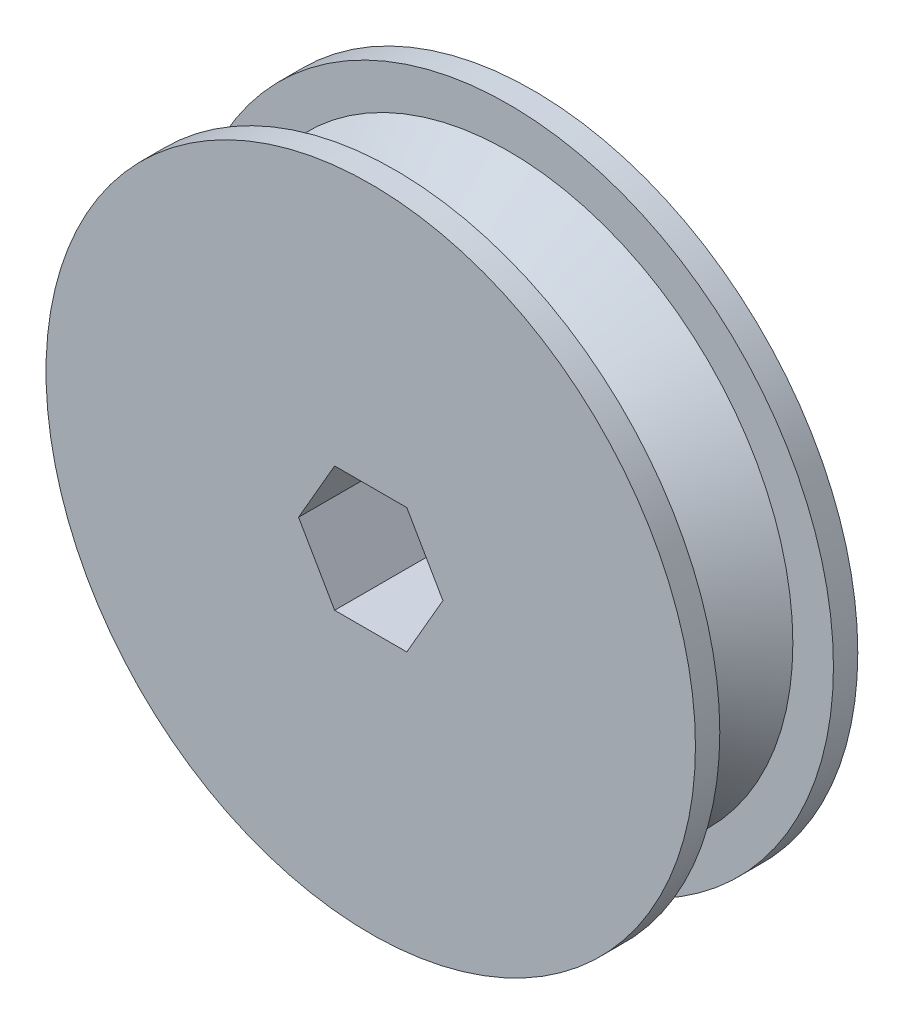
ISO-10303-21;
HEADER;
FILE_DESCRIPTION(('STEP AP214'),'2;1');
FILE_NAME('part.step','',(''),(''),'','','');
FILE_SCHEMA(('AUTOMOTIVE_DESIGN { 1 0 10303 214 1 1 1 1 }'));
ENDSEC;
DATA;
#1=APPLICATION_CONTEXT('core data for automotive mechanical design processes');
#2=APPLICATION_PROTOCOL_DEFINITION('international standard','automotive_design',2000,#1);
#3=PRODUCT_CONTEXT('',#1,'mechanical');
#4=PRODUCT('Part','Part','',(#3));
#5=PRODUCT_RELATED_PRODUCT_CATEGORY('part','',(#4));
#6=PRODUCT_DEFINITION_FORMATION('','',#4);
#7=PRODUCT_DEFINITION_CONTEXT('part definition',#1,'design');
#8=PRODUCT_DEFINITION('design','',#6,#7);
#9=PRODUCT_DEFINITION_SHAPE('','',#8);
#10=(LENGTH_UNIT() NAMED_UNIT(*) SI_UNIT(.MILLI.,.METRE.));
#11=(NAMED_UNIT(*) PLANE_ANGLE_UNIT() SI_UNIT($,.RADIAN.));
#12=(NAMED_UNIT(*) SI_UNIT($,.STERADIAN.) SOLID_ANGLE_UNIT());
#13=UNCERTAINTY_MEASURE_WITH_UNIT(LENGTH_MEASURE(1.E-05),#10,'distance_accuracy_value','');
#14=(GEOMETRIC_REPRESENTATION_CONTEXT(3) GLOBAL_UNCERTAINTY_ASSIGNED_CONTEXT((#13)) GLOBAL_UNIT_ASSIGNED_CONTEXT((#10,
#11,#12)) REPRESENTATION_CONTEXT('',''));
#15=CARTESIAN_POINT('',(0.,0.,0.));
#16=DIRECTION('',(0.,0.,1.));
#17=DIRECTION('',(1.,0.,0.));
#18=AXIS2_PLACEMENT_3D('',#15,#16,#17);
#19=CARTESIAN_POINT('',(0.,0.,6.35));
#20=DIRECTION('',(0.,0.,-1.));
#21=DIRECTION('',(-1.,0.,0.));
#22=AXIS2_PLACEMENT_3D('',#19,#20,#21);
#23=CYLINDRICAL_SURFACE('',#22,25.4);
#24=CARTESIAN_POINT('',(0.,0.,6.35));
#25=DIRECTION('',(0.,0.,1.));
#26=DIRECTION('',(1.,0.,0.));
#27=AXIS2_PLACEMENT_3D('',#24,#25,#26);
#28=CIRCLE('',#27,25.4);
#29=CARTESIAN_POINT('',(25.4,0.,6.35));
#30=VERTEX_POINT('',#29);
#31=EDGE_CURVE('E11',#30,#30,#28,.T.);
#32=ORIENTED_EDGE('',*,*,#31,.F.);
#33=EDGE_LOOP('',(#32));
#34=FACE_BOUND('',#33,.T.);
#35=CARTESIAN_POINT('',(0.,0.,4.445));
#36=DIRECTION('',(0.,0.,1.));
#37=DIRECTION('',(1.,0.,0.));
#38=AXIS2_PLACEMENT_3D('',#35,#36,#37);
#39=CIRCLE('',#38,25.4);
#40=CARTESIAN_POINT('',(25.4,0.,4.445));
#41=VERTEX_POINT('',#40);
#42=EDGE_CURVE('E143',#41,#41,#39,.T.);
#43=ORIENTED_EDGE('',*,*,#42,.T.);
#44=EDGE_LOOP('',(#43));
#45=FACE_BOUND('',#44,.T.);
#46=ADVANCED_FACE('F33',(#34,#45),#23,.T.);
#47=CARTESIAN_POINT('',(0.,0.,6.35));
#48=DIRECTION('',(0.,0.,1.));
#49=DIRECTION('',(1.,0.,0.));
#50=AXIS2_PLACEMENT_3D('',#47,#48,#49);
#51=PLANE('',#50);
#52=DIRECTION('',(-0.499999999999999,0.86602540378444,0.));
#53=VECTOR('',#52,1.);
#54=CARTESIAN_POINT('',(-2.82295414120268,-4.8895,6.35));
#55=LINE('',#54,#53);
#56=CARTESIAN_POINT('',(-2.82295414120268,-4.8895,6.35));
#57=VERTEX_POINT('',#56);
#58=CARTESIAN_POINT('',(-5.64590828240534,0.,6.35));
#59=VERTEX_POINT('',#58);
#60=EDGE_CURVE('E87',#57,#59,#55,.T.);
#61=ORIENTED_EDGE('',*,*,#60,.T.);
#62=DIRECTION('',(0.499999999999998,0.86602540378444,0.));
#63=VECTOR('',#62,1.);
#64=CARTESIAN_POINT('',(-5.64590828240534,0.,6.35));
#65=LINE('',#64,#63);
#66=CARTESIAN_POINT('',(-2.82295414120268,4.8895,6.35));
#67=VERTEX_POINT('',#66);
#68=EDGE_CURVE('E96',#59,#67,#65,.T.);
#69=ORIENTED_EDGE('',*,*,#68,.T.);
#70=DIRECTION('',(1.,0.,0.));
#71=VECTOR('',#70,1.);
#72=CARTESIAN_POINT('',(-2.82295414120268,4.8895,6.35));
#73=LINE('',#72,#71);
#74=CARTESIAN_POINT('',(2.82295414120268,4.8895,6.35));
#75=VERTEX_POINT('',#74);
#76=EDGE_CURVE('E47',#67,#75,#73,.T.);
#77=ORIENTED_EDGE('',*,*,#76,.T.);
#78=DIRECTION('',(0.499999999999999,-0.86602540378444,0.));
#79=VECTOR('',#78,1.);
#80=CARTESIAN_POINT('',(2.82295414120268,4.8895,6.35));
#81=LINE('',#80,#79);
#82=CARTESIAN_POINT('',(5.64590828240535,0.,6.35));
#83=VERTEX_POINT('',#82);
#84=EDGE_CURVE('E111',#75,#83,#81,.T.);
#85=ORIENTED_EDGE('',*,*,#84,.T.);
#86=DIRECTION('',(-0.499999999999998,-0.86602540378444,0.));
#87=VECTOR('',#86,1.);
#88=CARTESIAN_POINT('',(5.64590828240535,0.,6.35));
#89=LINE('',#88,#87);
#90=CARTESIAN_POINT('',(2.82295414120269,-4.8895,6.35));
#91=VERTEX_POINT('',#90);
#92=EDGE_CURVE('E114',#83,#91,#89,.T.);
#93=ORIENTED_EDGE('',*,*,#92,.T.);
#94=DIRECTION('',(-1.,0.,0.));
#95=VECTOR('',#94,1.);
#96=CARTESIAN_POINT('',(2.82295414120269,-4.8895,6.35));
#97=LINE('',#96,#95);
#98=EDGE_CURVE('E93',#91,#57,#97,.T.);
#99=ORIENTED_EDGE('',*,*,#98,.T.);
#100=EDGE_LOOP('',(#61,#69,#77,#85,#93,#99));
#101=FACE_BOUND('',#100,.T.);
#102=ORIENTED_EDGE('',*,*,#31,.T.);
#103=EDGE_LOOP('',(#102));
#104=FACE_BOUND('',#103,.T.);
#105=ADVANCED_FACE('F100',(#101,#104),#51,.T.);
#106=CARTESIAN_POINT('',(0.,0.,0.));
#107=DIRECTION('',(0.,0.,-1.));
#108=DIRECTION('',(-1.,0.,0.));
#109=AXIS2_PLACEMENT_3D('',#106,#107,#108);
#110=CONICAL_SURFACE('',#109,17.78,0.785398163397449);
#111=CARTESIAN_POINT('',(0.,0.,-4.445));
#112=DIRECTION('',(0.,0.,1.));
#113=DIRECTION('',(1.,0.,0.));
#114=AXIS2_PLACEMENT_3D('',#111,#112,#113);
#115=CIRCLE('',#114,22.225);
#116=CARTESIAN_POINT('',(22.225,0.,-4.445));
#117=VERTEX_POINT('',#116);
#118=EDGE_CURVE('E130',#117,#117,#115,.T.);
#119=ORIENTED_EDGE('',*,*,#118,.T.);
#120=EDGE_LOOP('',(#119));
#121=FACE_BOUND('',#120,.T.);
#122=CARTESIAN_POINT('',(0.,0.,0.));
#123=DIRECTION('',(0.,0.,1.));
#124=DIRECTION('',(1.,0.,0.));
#125=AXIS2_PLACEMENT_3D('',#122,#123,#124);
#126=CIRCLE('',#125,17.78);
#127=CARTESIAN_POINT('',(17.78,0.,0.));
#128=VERTEX_POINT('',#127);
#129=EDGE_CURVE('E149',#128,#128,#126,.T.);
#130=ORIENTED_EDGE('',*,*,#129,.F.);
#131=EDGE_LOOP('',(#130));
#132=FACE_BOUND('',#131,.T.);
#133=ADVANCED_FACE('F176',(#121,#132),#110,.T.);
#134=CARTESIAN_POINT('',(0.,0.,4.445));
#135=DIRECTION('',(0.,0.,1.));
#136=DIRECTION('',(1.,0.,0.));
#137=AXIS2_PLACEMENT_3D('',#134,#135,#136);
#138=CONICAL_SURFACE('',#137,22.225,0.785398163397449);
#139=ORIENTED_EDGE('',*,*,#129,.T.);
#140=EDGE_LOOP('',(#139));
#141=FACE_BOUND('',#140,.T.);
#142=CARTESIAN_POINT('',(0.,0.,4.445));
#143=DIRECTION('',(0.,0.,1.));
#144=DIRECTION('',(1.,0.,0.));
#145=AXIS2_PLACEMENT_3D('',#142,#143,#144);
#146=CIRCLE('',#145,22.225);
#147=CARTESIAN_POINT('',(22.225,0.,4.445));
#148=VERTEX_POINT('',#147);
#149=EDGE_CURVE('E146',#148,#148,#146,.T.);
#150=ORIENTED_EDGE('',*,*,#149,.F.);
#151=EDGE_LOOP('',(#150));
#152=FACE_BOUND('',#151,.T.);
#153=ADVANCED_FACE('F182',(#141,#152),#138,.T.);
#154=CARTESIAN_POINT('',(-22.225,0.,4.445));
#155=DIRECTION('',(0.,0.,-1.));
#156=DIRECTION('',(-1.,0.,0.));
#157=AXIS2_PLACEMENT_3D('',#154,#155,#156);
#158=PLANE('',#157);
#159=ORIENTED_EDGE('',*,*,#149,.T.);
#160=EDGE_LOOP('',(#159));
#161=FACE_BOUND('',#160,.T.);
#162=ORIENTED_EDGE('',*,*,#42,.F.);
#163=EDGE_LOOP('',(#162));
#164=FACE_BOUND('',#163,.T.);
#165=ADVANCED_FACE('F167',(#161,#164),#158,.T.);
#166=CARTESIAN_POINT('',(-22.225,0.,-4.445));
#167=DIRECTION('',(0.,0.,1.));
#168=DIRECTION('',(1.,0.,0.));
#169=AXIS2_PLACEMENT_3D('',#166,#167,#168);
#170=PLANE('',#169);
#171=CARTESIAN_POINT('',(0.,0.,-4.445));
#172=DIRECTION('',(0.,0.,1.));
#173=DIRECTION('',(1.,0.,0.));
#174=AXIS2_PLACEMENT_3D('',#171,#172,#173);
#175=CIRCLE('',#174,25.4);
#176=CARTESIAN_POINT('',(25.4,0.,-4.445));
#177=VERTEX_POINT('',#176);
#178=EDGE_CURVE('E140',#177,#177,#175,.T.);
#179=ORIENTED_EDGE('',*,*,#178,.T.);
#180=EDGE_LOOP('',(#179));
#181=FACE_BOUND('',#180,.T.);
#182=ORIENTED_EDGE('',*,*,#118,.F.);
#183=EDGE_LOOP('',(#182));
#184=FACE_BOUND('',#183,.T.);
#185=ADVANCED_FACE('F161',(#181,#184),#170,.T.);
#186=CARTESIAN_POINT('',(0.,0.,-6.35));
#187=DIRECTION('',(0.,0.,1.));
#188=DIRECTION('',(1.,0.,0.));
#189=AXIS2_PLACEMENT_3D('',#186,#187,#188);
#190=PLANE('',#189);
#191=DIRECTION('',(0.499999999999998,0.86602540378444,0.));
#192=VECTOR('',#191,1.);
#193=CARTESIAN_POINT('',(-5.64590828240534,0.,-6.35));
#194=LINE('',#193,#192);
#195=CARTESIAN_POINT('',(-5.64590828240534,0.,-6.35));
#196=VERTEX_POINT('',#195);
#197=CARTESIAN_POINT('',(-2.82295414120268,4.8895,-6.35));
#198=VERTEX_POINT('',#197);
#199=EDGE_CURVE('E118',#196,#198,#194,.T.);
#200=ORIENTED_EDGE('',*,*,#199,.F.);
#201=DIRECTION('',(-0.499999999999999,0.86602540378444,0.));
#202=VECTOR('',#201,1.);
#203=CARTESIAN_POINT('',(-2.82295414120268,-4.8895,-6.35));
#204=LINE('',#203,#202);
#205=CARTESIAN_POINT('',(-2.82295414120268,-4.8895,-6.35));
#206=VERTEX_POINT('',#205);
#207=EDGE_CURVE('E55',#206,#196,#204,.T.);
#208=ORIENTED_EDGE('',*,*,#207,.F.);
#209=DIRECTION('',(-1.,0.,0.));
#210=VECTOR('',#209,1.);
#211=CARTESIAN_POINT('',(2.82295414120269,-4.8895,-6.35));
#212=LINE('',#211,#210);
#213=CARTESIAN_POINT('',(2.82295414120269,-4.8895,-6.35));
#214=VERTEX_POINT('',#213);
#215=EDGE_CURVE('E104',#214,#206,#212,.T.);
#216=ORIENTED_EDGE('',*,*,#215,.F.);
#217=DIRECTION('',(-0.499999999999998,-0.86602540378444,0.));
#218=VECTOR('',#217,1.);
#219=CARTESIAN_POINT('',(5.64590828240535,0.,-6.35));
#220=LINE('',#219,#218);
#221=CARTESIAN_POINT('',(5.64590828240535,0.,-6.35));
#222=VERTEX_POINT('',#221);
#223=EDGE_CURVE('E107',#222,#214,#220,.T.);
#224=ORIENTED_EDGE('',*,*,#223,.F.);
#225=DIRECTION('',(0.499999999999999,-0.86602540378444,0.));
#226=VECTOR('',#225,1.);
#227=CARTESIAN_POINT('',(2.82295414120268,4.8895,-6.35));
#228=LINE('',#227,#226);
#229=CARTESIAN_POINT('',(2.82295414120268,4.8895,-6.35));
#230=VERTEX_POINT('',#229);
#231=EDGE_CURVE('E123',#230,#222,#228,.T.);
#232=ORIENTED_EDGE('',*,*,#231,.F.);
#233=DIRECTION('',(1.,0.,0.));
#234=VECTOR('',#233,1.);
#235=CARTESIAN_POINT('',(-2.82295414120268,4.8895,-6.35));
#236=LINE('',#235,#234);
#237=EDGE_CURVE('E120',#198,#230,#236,.T.);
#238=ORIENTED_EDGE('',*,*,#237,.F.);
#239=EDGE_LOOP('',(#200,#208,#216,#224,#232,#238));
#240=FACE_BOUND('',#239,.T.);
#241=CARTESIAN_POINT('',(0.,0.,-6.35));
#242=DIRECTION('',(0.,0.,1.));
#243=DIRECTION('',(1.,0.,0.));
#244=AXIS2_PLACEMENT_3D('',#241,#242,#243);
#245=CIRCLE('',#244,25.4);
#246=CARTESIAN_POINT('',(25.4,0.,-6.35));
#247=VERTEX_POINT('',#246);
#248=EDGE_CURVE('E36',#247,#247,#245,.T.);
#249=ORIENTED_EDGE('',*,*,#248,.F.);
#250=EDGE_LOOP('',(#249));
#251=FACE_BOUND('',#250,.T.);
#252=ADVANCED_FACE('F159',(#240,#251),#190,.F.);
#253=ORIENTED_EDGE('',*,*,#248,.T.);
#254=EDGE_LOOP('',(#253));
#255=FACE_BOUND('',#254,.T.);
#256=ORIENTED_EDGE('',*,*,#178,.F.);
#257=EDGE_LOOP('',(#256));
#258=FACE_BOUND('',#257,.T.);
#259=ADVANCED_FACE('F156',(#255,#258),#23,.T.);
#260=CARTESIAN_POINT('',(-2.82295414120268,-4.8895,6.35));
#261=DIRECTION('',(-0.866025403784439,-0.499999999999999,0.));
#262=DIRECTION('',(0.499999999999999,-0.866025403784439,0.));
#263=AXIS2_PLACEMENT_3D('',#260,#261,#262);
#264=PLANE('',#263);
#265=ORIENTED_EDGE('',*,*,#207,.T.);
#266=DIRECTION('',(0.,0.,-1.));
#267=VECTOR('',#266,1.);
#268=CARTESIAN_POINT('',(-5.64590828240534,0.,6.35));
#269=LINE('',#268,#267);
#270=EDGE_CURVE('E83',#59,#196,#269,.T.);
#271=ORIENTED_EDGE('',*,*,#270,.F.);
#272=ORIENTED_EDGE('',*,*,#60,.F.);
#273=DIRECTION('',(0.,0.,-1.));
#274=VECTOR('',#273,1.);
#275=CARTESIAN_POINT('',(-2.82295414120268,-4.8895,6.35));
#276=LINE('',#275,#274);
#277=EDGE_CURVE('E128',#57,#206,#276,.T.);
#278=ORIENTED_EDGE('',*,*,#277,.T.);
#279=EDGE_LOOP('',(#265,#271,#272,#278));
#280=FACE_BOUND('',#279,.T.);
#281=ADVANCED_FACE('F85',(#280),#264,.F.);
#282=CARTESIAN_POINT('',(2.82295414120269,-4.8895,6.35));
#283=DIRECTION('',(0.,-1.,0.));
#284=DIRECTION('',(0.,0.,-1.));
#285=AXIS2_PLACEMENT_3D('',#282,#283,#284);
#286=PLANE('',#285);
#287=ORIENTED_EDGE('',*,*,#215,.T.);
#288=ORIENTED_EDGE('',*,*,#277,.F.);
#289=ORIENTED_EDGE('',*,*,#98,.F.);
#290=DIRECTION('',(0.,0.,-1.));
#291=VECTOR('',#290,1.);
#292=CARTESIAN_POINT('',(2.82295414120269,-4.8895,6.35));
#293=LINE('',#292,#291);
#294=EDGE_CURVE('E131',#91,#214,#293,.T.);
#295=ORIENTED_EDGE('',*,*,#294,.T.);
#296=EDGE_LOOP('',(#287,#288,#289,#295));
#297=FACE_BOUND('',#296,.T.);
#298=ADVANCED_FACE('F238',(#297),#286,.F.);
#299=CARTESIAN_POINT('',(5.64590828240535,0.,6.35));
#300=DIRECTION('',(0.86602540378444,-0.499999999999998,0.));
#301=DIRECTION('',(0.499999999999998,0.86602540378444,0.));
#302=AXIS2_PLACEMENT_3D('',#299,#300,#301);
#303=PLANE('',#302);
#304=ORIENTED_EDGE('',*,*,#223,.T.);
#305=ORIENTED_EDGE('',*,*,#294,.F.);
#306=ORIENTED_EDGE('',*,*,#92,.F.);
#307=DIRECTION('',(0.,0.,-1.));
#308=VECTOR('',#307,1.);
#309=CARTESIAN_POINT('',(5.64590828240535,0.,6.35));
#310=LINE('',#309,#308);
#311=EDGE_CURVE('E133',#83,#222,#310,.T.);
#312=ORIENTED_EDGE('',*,*,#311,.T.);
#313=EDGE_LOOP('',(#304,#305,#306,#312));
#314=FACE_BOUND('',#313,.T.);
#315=ADVANCED_FACE('F246',(#314),#303,.F.);
#316=CARTESIAN_POINT('',(2.82295414120268,4.8895,6.35));
#317=DIRECTION('',(0.866025403784439,0.499999999999999,0.));
#318=DIRECTION('',(-0.499999999999999,0.866025403784439,0.));
#319=AXIS2_PLACEMENT_3D('',#316,#317,#318);
#320=PLANE('',#319);
#321=ORIENTED_EDGE('',*,*,#231,.T.);
#322=ORIENTED_EDGE('',*,*,#311,.F.);
#323=ORIENTED_EDGE('',*,*,#84,.F.);
#324=DIRECTION('',(0.,0.,-1.));
#325=VECTOR('',#324,1.);
#326=CARTESIAN_POINT('',(2.82295414120268,4.8895,6.35));
#327=LINE('',#326,#325);
#328=EDGE_CURVE('E135',#75,#230,#327,.T.);
#329=ORIENTED_EDGE('',*,*,#328,.T.);
#330=EDGE_LOOP('',(#321,#322,#323,#329));
#331=FACE_BOUND('',#330,.T.);
#332=ADVANCED_FACE('F256',(#331),#320,.F.);
#333=CARTESIAN_POINT('',(-2.82295414120268,4.8895,6.35));
#334=DIRECTION('',(0.,1.,0.));
#335=DIRECTION('',(0.,0.,1.));
#336=AXIS2_PLACEMENT_3D('',#333,#334,#335);
#337=PLANE('',#336);
#338=ORIENTED_EDGE('',*,*,#237,.T.);
#339=ORIENTED_EDGE('',*,*,#328,.F.);
#340=ORIENTED_EDGE('',*,*,#76,.F.);
#341=DIRECTION('',(0.,0.,-1.));
#342=VECTOR('',#341,1.);
#343=CARTESIAN_POINT('',(-2.82295414120268,4.8895,6.35));
#344=LINE('',#343,#342);
#345=EDGE_CURVE('E92',#67,#198,#344,.T.);
#346=ORIENTED_EDGE('',*,*,#345,.T.);
#347=EDGE_LOOP('',(#338,#339,#340,#346));
#348=FACE_BOUND('',#347,.T.);
#349=ADVANCED_FACE('F266',(#348),#337,.F.);
#350=CARTESIAN_POINT('',(-5.64590828240534,0.,6.35));
#351=DIRECTION('',(-0.86602540378444,0.499999999999998,0.));
#352=DIRECTION('',(-0.499999999999998,-0.86602540378444,0.));
#353=AXIS2_PLACEMENT_3D('',#350,#351,#352);
#354=PLANE('',#353);
#355=ORIENTED_EDGE('',*,*,#199,.T.);
#356=ORIENTED_EDGE('',*,*,#345,.F.);
#357=ORIENTED_EDGE('',*,*,#68,.F.);
#358=ORIENTED_EDGE('',*,*,#270,.T.);
#359=EDGE_LOOP('',(#355,#356,#357,#358));
#360=FACE_BOUND('',#359,.T.);
#361=ADVANCED_FACE('F97',(#360),#354,.F.);
#362=CLOSED_SHELL('',(#46,#105,#133,#153,#165,#185,#252,#259,#281,#298,#315,#332,#349,#361));
#363=MANIFOLD_SOLID_BREP('B2',#362);
#364=ADVANCED_BREP_SHAPE_REPRESENTATION('',(#18,#363),#14);
#365=SHAPE_DEFINITION_REPRESENTATION(#9,#364);
ENDSEC;
END-ISO-10303-21;
